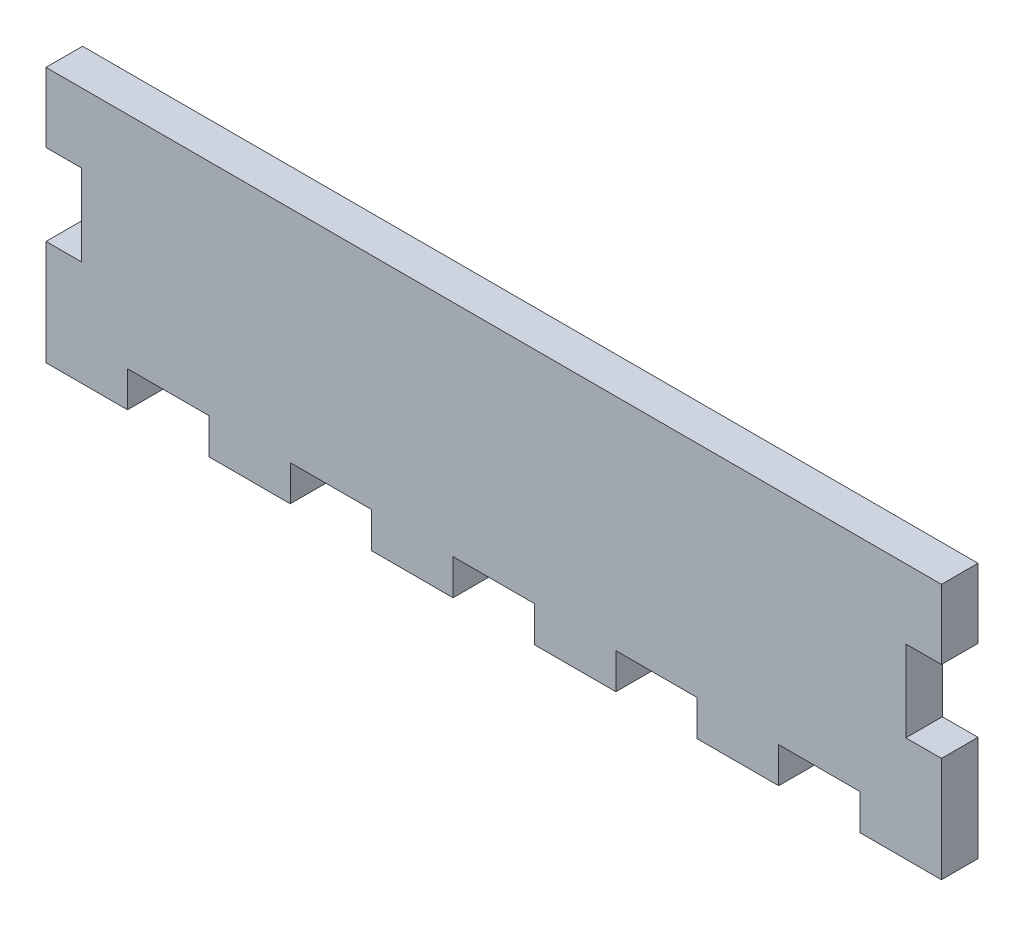
ISO-10303-21;
HEADER;
FILE_DESCRIPTION(('STEP AP214'),'2;1');
FILE_NAME('part.step','',(''),(''),'','','');
FILE_SCHEMA(('AUTOMOTIVE_DESIGN { 1 0 10303 214 1 1 1 1 }'));
ENDSEC;
DATA;
#1=APPLICATION_CONTEXT('core data for automotive mechanical design processes');
#2=APPLICATION_PROTOCOL_DEFINITION('international standard','automotive_design',2000,#1);
#3=PRODUCT_CONTEXT('',#1,'mechanical');
#4=PRODUCT('Part','Part','',(#3));
#5=PRODUCT_RELATED_PRODUCT_CATEGORY('part','',(#4));
#6=PRODUCT_DEFINITION_FORMATION('','',#4);
#7=PRODUCT_DEFINITION_CONTEXT('part definition',#1,'design');
#8=PRODUCT_DEFINITION('design','',#6,#7);
#9=PRODUCT_DEFINITION_SHAPE('','',#8);
#10=(LENGTH_UNIT() NAMED_UNIT(*) SI_UNIT(.MILLI.,.METRE.));
#11=(NAMED_UNIT(*) PLANE_ANGLE_UNIT() SI_UNIT($,.RADIAN.));
#12=(NAMED_UNIT(*) SI_UNIT($,.STERADIAN.) SOLID_ANGLE_UNIT());
#13=UNCERTAINTY_MEASURE_WITH_UNIT(LENGTH_MEASURE(1.E-05),#10,'distance_accuracy_value','');
#14=(GEOMETRIC_REPRESENTATION_CONTEXT(3) GLOBAL_UNCERTAINTY_ASSIGNED_CONTEXT((#13)) GLOBAL_UNIT_ASSIGNED_CONTEXT((#10,
#11,#12)) REPRESENTATION_CONTEXT('',''));
#15=CARTESIAN_POINT('',(0.,0.,0.));
#16=DIRECTION('',(0.,0.,1.));
#17=DIRECTION('',(1.,0.,0.));
#18=AXIS2_PLACEMENT_3D('',#15,#16,#17);
#19=CARTESIAN_POINT('',(-140.425884488404,0.0664562332948994,-4.));
#20=DIRECTION('',(-1.,0.,0.));
#21=DIRECTION('',(0.,0.,1.));
#22=AXIS2_PLACEMENT_3D('',#19,#20,#21);
#23=PLANE('',#22);
#24=DIRECTION('',(0.,-1.,0.));
#25=VECTOR('',#24,1.);
#26=CARTESIAN_POINT('',(-140.425884488404,0.0664562332948994,0.));
#27=LINE('',#26,#25);
#28=CARTESIAN_POINT('',(-140.425884488404,11.5664562332949,0.));
#29=VERTEX_POINT('',#28);
#30=CARTESIAN_POINT('',(-140.425884488404,0.0664562332948994,0.));
#31=VERTEX_POINT('',#30);
#32=EDGE_CURVE('E273',#29,#31,#27,.T.);
#33=ORIENTED_EDGE('',*,*,#32,.F.);
#34=DIRECTION('',(0.,0.,1.));
#35=VECTOR('',#34,1.);
#36=CARTESIAN_POINT('',(-140.425884488404,11.5664562332949,-4.));
#37=LINE('',#36,#35);
#38=CARTESIAN_POINT('',(-140.425884488404,11.5664562332949,-4.));
#39=VERTEX_POINT('',#38);
#40=EDGE_CURVE('E11',#39,#29,#37,.T.);
#41=ORIENTED_EDGE('',*,*,#40,.F.);
#42=DIRECTION('',(0.,-1.,0.));
#43=VECTOR('',#42,1.);
#44=CARTESIAN_POINT('',(-140.425884488404,0.0664562332948994,-4.));
#45=LINE('',#44,#43);
#46=CARTESIAN_POINT('',(-140.425884488404,0.0664562332948994,-4.));
#47=VERTEX_POINT('',#46);
#48=EDGE_CURVE('E365',#39,#47,#45,.T.);
#49=ORIENTED_EDGE('',*,*,#48,.T.);
#50=DIRECTION('',(0.,0.,1.));
#51=VECTOR('',#50,1.);
#52=CARTESIAN_POINT('',(-140.425884488404,0.0664562332948994,-4.));
#53=LINE('',#52,#51);
#54=EDGE_CURVE('E35',#47,#31,#53,.T.);
#55=ORIENTED_EDGE('',*,*,#54,.T.);
#56=EDGE_LOOP('',(#33,#41,#49,#55));
#57=FACE_BOUND('',#56,.T.);
#58=ADVANCED_FACE('F32',(#57),#23,.T.);
#59=CARTESIAN_POINT('',(-140.425884488404,11.5664562332949,-4.));
#60=DIRECTION('',(0.,1.,0.));
#61=DIRECTION('',(0.,0.,1.));
#62=AXIS2_PLACEMENT_3D('',#59,#60,#61);
#63=PLANE('',#62);
#64=DIRECTION('',(-1.,0.,0.));
#65=VECTOR('',#64,1.);
#66=CARTESIAN_POINT('',(-140.425884488404,11.5664562332949,0.));
#67=LINE('',#66,#65);
#68=CARTESIAN_POINT('',(-136.525884488404,11.5664562332949,0.));
#69=VERTEX_POINT('',#68);
#70=EDGE_CURVE('E363',#69,#29,#67,.T.);
#71=ORIENTED_EDGE('',*,*,#70,.F.);
#72=DIRECTION('',(0.,0.,1.));
#73=VECTOR('',#72,1.);
#74=CARTESIAN_POINT('',(-136.525884488404,11.5664562332949,-4.));
#75=LINE('',#74,#73);
#76=CARTESIAN_POINT('',(-136.525884488404,11.5664562332949,-4.));
#77=VERTEX_POINT('',#76);
#78=EDGE_CURVE('E41',#77,#69,#75,.T.);
#79=ORIENTED_EDGE('',*,*,#78,.F.);
#80=DIRECTION('',(-1.,0.,0.));
#81=VECTOR('',#80,1.);
#82=CARTESIAN_POINT('',(-140.425884488404,11.5664562332949,-4.));
#83=LINE('',#82,#81);
#84=EDGE_CURVE('E263',#77,#39,#83,.T.);
#85=ORIENTED_EDGE('',*,*,#84,.T.);
#86=ORIENTED_EDGE('',*,*,#40,.T.);
#87=EDGE_LOOP('',(#71,#79,#85,#86));
#88=FACE_BOUND('',#87,.T.);
#89=ADVANCED_FACE('F425',(#88),#63,.T.);
#90=CARTESIAN_POINT('',(-136.525884488404,20.4664562332949,-4.));
#91=DIRECTION('',(-1.,0.,0.));
#92=DIRECTION('',(0.,0.,1.));
#93=AXIS2_PLACEMENT_3D('',#90,#91,#92);
#94=PLANE('',#93);
#95=DIRECTION('',(0.,-1.,0.));
#96=VECTOR('',#95,1.);
#97=CARTESIAN_POINT('',(-136.525884488404,20.4664562332949,0.));
#98=LINE('',#97,#96);
#99=CARTESIAN_POINT('',(-136.525884488404,20.4664562332949,0.));
#100=VERTEX_POINT('',#99);
#101=EDGE_CURVE('E250',#100,#69,#98,.T.);
#102=ORIENTED_EDGE('',*,*,#101,.F.);
#103=DIRECTION('',(0.,0.,1.));
#104=VECTOR('',#103,1.);
#105=CARTESIAN_POINT('',(-136.525884488404,20.4664562332949,-4.));
#106=LINE('',#105,#104);
#107=CARTESIAN_POINT('',(-136.525884488404,20.4664562332949,-4.));
#108=VERTEX_POINT('',#107);
#109=EDGE_CURVE('E245',#108,#100,#106,.T.);
#110=ORIENTED_EDGE('',*,*,#109,.F.);
#111=DIRECTION('',(0.,-1.,0.));
#112=VECTOR('',#111,1.);
#113=CARTESIAN_POINT('',(-136.525884488404,20.4664562332949,-4.));
#114=LINE('',#113,#112);
#115=EDGE_CURVE('E248',#108,#77,#114,.T.);
#116=ORIENTED_EDGE('',*,*,#115,.T.);
#117=ORIENTED_EDGE('',*,*,#78,.T.);
#118=EDGE_LOOP('',(#102,#110,#116,#117));
#119=FACE_BOUND('',#118,.T.);
#120=ADVANCED_FACE('F247',(#119),#94,.T.);
#121=CARTESIAN_POINT('',(-140.425884488404,20.4664562332949,-4.));
#122=DIRECTION('',(0.,-1.,0.));
#123=DIRECTION('',(0.,0.,-1.));
#124=AXIS2_PLACEMENT_3D('',#121,#122,#123);
#125=PLANE('',#124);
#126=DIRECTION('',(1.,0.,0.));
#127=VECTOR('',#126,1.);
#128=CARTESIAN_POINT('',(-140.425884488404,20.4664562332949,0.));
#129=LINE('',#128,#127);
#130=CARTESIAN_POINT('',(-140.425884488404,20.4664562332949,0.));
#131=VERTEX_POINT('',#130);
#132=EDGE_CURVE('E360',#131,#100,#129,.T.);
#133=ORIENTED_EDGE('',*,*,#132,.F.);
#134=DIRECTION('',(0.,0.,1.));
#135=VECTOR('',#134,1.);
#136=CARTESIAN_POINT('',(-140.425884488404,20.4664562332949,-4.));
#137=LINE('',#136,#135);
#138=CARTESIAN_POINT('',(-140.425884488404,20.4664562332949,-4.));
#139=VERTEX_POINT('',#138);
#140=EDGE_CURVE('E255',#139,#131,#137,.T.);
#141=ORIENTED_EDGE('',*,*,#140,.F.);
#142=DIRECTION('',(1.,0.,0.));
#143=VECTOR('',#142,1.);
#144=CARTESIAN_POINT('',(-140.425884488404,20.4664562332949,-4.));
#145=LINE('',#144,#143);
#146=EDGE_CURVE('E261',#139,#108,#145,.T.);
#147=ORIENTED_EDGE('',*,*,#146,.T.);
#148=ORIENTED_EDGE('',*,*,#109,.T.);
#149=EDGE_LOOP('',(#133,#141,#147,#148));
#150=FACE_BOUND('',#149,.T.);
#151=ADVANCED_FACE('F265',(#150),#125,.T.);
#152=CARTESIAN_POINT('',(-140.425884488404,20.4664562332949,-4.));
#153=DIRECTION('',(-1.,0.,0.));
#154=DIRECTION('',(0.,0.,1.));
#155=AXIS2_PLACEMENT_3D('',#152,#153,#154);
#156=PLANE('',#155);
#157=DIRECTION('',(0.,-1.,0.));
#158=VECTOR('',#157,1.);
#159=CARTESIAN_POINT('',(-140.425884488404,20.4664562332949,0.));
#160=LINE('',#159,#158);
#161=CARTESIAN_POINT('',(-140.425884488404,28.0664562332949,0.));
#162=VERTEX_POINT('',#161);
#163=EDGE_CURVE('E357',#162,#131,#160,.T.);
#164=ORIENTED_EDGE('',*,*,#163,.F.);
#165=DIRECTION('',(0.,0.,1.));
#166=VECTOR('',#165,1.);
#167=CARTESIAN_POINT('',(-140.425884488404,28.0664562332949,-4.));
#168=LINE('',#167,#166);
#169=CARTESIAN_POINT('',(-140.425884488404,28.0664562332949,-4.));
#170=VERTEX_POINT('',#169);
#171=EDGE_CURVE('E369',#170,#162,#168,.T.);
#172=ORIENTED_EDGE('',*,*,#171,.F.);
#173=DIRECTION('',(0.,-1.,0.));
#174=VECTOR('',#173,1.);
#175=CARTESIAN_POINT('',(-140.425884488404,20.4664562332949,-4.));
#176=LINE('',#175,#174);
#177=EDGE_CURVE('E266',#170,#139,#176,.T.);
#178=ORIENTED_EDGE('',*,*,#177,.T.);
#179=ORIENTED_EDGE('',*,*,#140,.T.);
#180=EDGE_LOOP('',(#164,#172,#178,#179));
#181=FACE_BOUND('',#180,.T.);
#182=ADVANCED_FACE('F439',(#181),#156,.T.);
#183=CARTESIAN_POINT('',(-140.425884488404,28.0664562332949,-4.));
#184=DIRECTION('',(0.,1.,0.));
#185=DIRECTION('',(0.,0.,1.));
#186=AXIS2_PLACEMENT_3D('',#183,#184,#185);
#187=PLANE('',#186);
#188=DIRECTION('',(-1.,0.,0.));
#189=VECTOR('',#188,1.);
#190=CARTESIAN_POINT('',(-140.425884488404,28.0664562332949,0.));
#191=LINE('',#190,#189);
#192=CARTESIAN_POINT('',(-42.4258844884038,28.0664562332949,0.));
#193=VERTEX_POINT('',#192);
#194=EDGE_CURVE('E354',#193,#162,#191,.T.);
#195=ORIENTED_EDGE('',*,*,#194,.F.);
#196=DIRECTION('',(0.,0.,1.));
#197=VECTOR('',#196,1.);
#198=CARTESIAN_POINT('',(-42.4258844884038,28.0664562332949,-4.));
#199=LINE('',#198,#197);
#200=CARTESIAN_POINT('',(-42.4258844884038,28.0664562332949,-4.));
#201=VERTEX_POINT('',#200);
#202=EDGE_CURVE('E371',#201,#193,#199,.T.);
#203=ORIENTED_EDGE('',*,*,#202,.F.);
#204=DIRECTION('',(-1.,0.,0.));
#205=VECTOR('',#204,1.);
#206=CARTESIAN_POINT('',(-140.425884488404,28.0664562332949,-4.));
#207=LINE('',#206,#205);
#208=EDGE_CURVE('E268',#201,#170,#207,.T.);
#209=ORIENTED_EDGE('',*,*,#208,.T.);
#210=ORIENTED_EDGE('',*,*,#171,.T.);
#211=EDGE_LOOP('',(#195,#203,#209,#210));
#212=FACE_BOUND('',#211,.T.);
#213=ADVANCED_FACE('F442',(#212),#187,.T.);
#214=CARTESIAN_POINT('',(-42.4258844884038,20.4664562332949,-4.));
#215=DIRECTION('',(1.,0.,0.));
#216=DIRECTION('',(0.,0.,-1.));
#217=AXIS2_PLACEMENT_3D('',#214,#215,#216);
#218=PLANE('',#217);
#219=DIRECTION('',(0.,1.,0.));
#220=VECTOR('',#219,1.);
#221=CARTESIAN_POINT('',(-42.4258844884038,20.4664562332949,0.));
#222=LINE('',#221,#220);
#223=CARTESIAN_POINT('',(-42.4258844884038,20.4664562332949,0.));
#224=VERTEX_POINT('',#223);
#225=EDGE_CURVE('E351',#224,#193,#222,.T.);
#226=ORIENTED_EDGE('',*,*,#225,.F.);
#227=DIRECTION('',(0.,0.,1.));
#228=VECTOR('',#227,1.);
#229=CARTESIAN_POINT('',(-42.4258844884038,20.4664562332949,-4.));
#230=LINE('',#229,#228);
#231=CARTESIAN_POINT('',(-42.4258844884038,20.4664562332949,-4.));
#232=VERTEX_POINT('',#231);
#233=EDGE_CURVE('E373',#232,#224,#230,.T.);
#234=ORIENTED_EDGE('',*,*,#233,.F.);
#235=DIRECTION('',(0.,1.,0.));
#236=VECTOR('',#235,1.);
#237=CARTESIAN_POINT('',(-42.4258844884038,20.4664562332949,-4.));
#238=LINE('',#237,#236);
#239=EDGE_CURVE('E848',#232,#201,#238,.T.);
#240=ORIENTED_EDGE('',*,*,#239,.T.);
#241=ORIENTED_EDGE('',*,*,#202,.T.);
#242=EDGE_LOOP('',(#226,#234,#240,#241));
#243=FACE_BOUND('',#242,.T.);
#244=ADVANCED_FACE('F446',(#243),#218,.T.);
#245=CARTESIAN_POINT('',(-42.4258844884038,20.4664562332949,-4.));
#246=DIRECTION('',(0.,-1.,0.));
#247=DIRECTION('',(0.,0.,-1.));
#248=AXIS2_PLACEMENT_3D('',#245,#246,#247);
#249=PLANE('',#248);
#250=DIRECTION('',(1.,0.,0.));
#251=VECTOR('',#250,1.);
#252=CARTESIAN_POINT('',(-42.4258844884038,20.4664562332949,0.));
#253=LINE('',#252,#251);
#254=CARTESIAN_POINT('',(-46.3258844884038,20.4664562332949,0.));
#255=VERTEX_POINT('',#254);
#256=EDGE_CURVE('E348',#255,#224,#253,.T.);
#257=ORIENTED_EDGE('',*,*,#256,.F.);
#258=DIRECTION('',(0.,0.,1.));
#259=VECTOR('',#258,1.);
#260=CARTESIAN_POINT('',(-46.3258844884038,20.4664562332949,-4.));
#261=LINE('',#260,#259);
#262=CARTESIAN_POINT('',(-46.3258844884038,20.4664562332949,-4.));
#263=VERTEX_POINT('',#262);
#264=EDGE_CURVE('E375',#263,#255,#261,.T.);
#265=ORIENTED_EDGE('',*,*,#264,.F.);
#266=DIRECTION('',(1.,0.,0.));
#267=VECTOR('',#266,1.);
#268=CARTESIAN_POINT('',(-42.4258844884038,20.4664562332949,-4.));
#269=LINE('',#268,#267);
#270=EDGE_CURVE('E841',#263,#232,#269,.T.);
#271=ORIENTED_EDGE('',*,*,#270,.T.);
#272=ORIENTED_EDGE('',*,*,#233,.T.);
#273=EDGE_LOOP('',(#257,#265,#271,#272));
#274=FACE_BOUND('',#273,.T.);
#275=ADVANCED_FACE('F450',(#274),#249,.T.);
#276=CARTESIAN_POINT('',(-46.3258844884038,20.4664562332949,-4.));
#277=DIRECTION('',(1.,0.,0.));
#278=DIRECTION('',(0.,0.,-1.));
#279=AXIS2_PLACEMENT_3D('',#276,#277,#278);
#280=PLANE('',#279);
#281=DIRECTION('',(0.,1.,0.));
#282=VECTOR('',#281,1.);
#283=CARTESIAN_POINT('',(-46.3258844884038,20.4664562332949,0.));
#284=LINE('',#283,#282);
#285=CARTESIAN_POINT('',(-46.3258844884038,11.5664562332949,0.));
#286=VERTEX_POINT('',#285);
#287=EDGE_CURVE('E345',#286,#255,#284,.T.);
#288=ORIENTED_EDGE('',*,*,#287,.F.);
#289=DIRECTION('',(0.,0.,1.));
#290=VECTOR('',#289,1.);
#291=CARTESIAN_POINT('',(-46.3258844884038,11.5664562332949,-4.));
#292=LINE('',#291,#290);
#293=CARTESIAN_POINT('',(-46.3258844884038,11.5664562332949,-4.));
#294=VERTEX_POINT('',#293);
#295=EDGE_CURVE('E377',#294,#286,#292,.T.);
#296=ORIENTED_EDGE('',*,*,#295,.F.);
#297=DIRECTION('',(0.,1.,0.));
#298=VECTOR('',#297,1.);
#299=CARTESIAN_POINT('',(-46.3258844884038,20.4664562332949,-4.));
#300=LINE('',#299,#298);
#301=EDGE_CURVE('E837',#294,#263,#300,.T.);
#302=ORIENTED_EDGE('',*,*,#301,.T.);
#303=ORIENTED_EDGE('',*,*,#264,.T.);
#304=EDGE_LOOP('',(#288,#296,#302,#303));
#305=FACE_BOUND('',#304,.T.);
#306=ADVANCED_FACE('F454',(#305),#280,.T.);
#307=CARTESIAN_POINT('',(-42.4258844884038,11.5664562332949,-4.));
#308=DIRECTION('',(0.,1.,0.));
#309=DIRECTION('',(0.,0.,1.));
#310=AXIS2_PLACEMENT_3D('',#307,#308,#309);
#311=PLANE('',#310);
#312=DIRECTION('',(-1.,0.,0.));
#313=VECTOR('',#312,1.);
#314=CARTESIAN_POINT('',(-42.4258844884038,11.5664562332949,0.));
#315=LINE('',#314,#313);
#316=CARTESIAN_POINT('',(-42.4258844884038,11.5664562332949,0.));
#317=VERTEX_POINT('',#316);
#318=EDGE_CURVE('E342',#317,#286,#315,.T.);
#319=ORIENTED_EDGE('',*,*,#318,.F.);
#320=DIRECTION('',(0.,0.,1.));
#321=VECTOR('',#320,1.);
#322=CARTESIAN_POINT('',(-42.4258844884038,11.5664562332949,-4.));
#323=LINE('',#322,#321);
#324=CARTESIAN_POINT('',(-42.4258844884038,11.5664562332949,-4.));
#325=VERTEX_POINT('',#324);
#326=EDGE_CURVE('E379',#325,#317,#323,.T.);
#327=ORIENTED_EDGE('',*,*,#326,.F.);
#328=DIRECTION('',(-1.,0.,0.));
#329=VECTOR('',#328,1.);
#330=CARTESIAN_POINT('',(-42.4258844884038,11.5664562332949,-4.));
#331=LINE('',#330,#329);
#332=EDGE_CURVE('E853',#325,#294,#331,.T.);
#333=ORIENTED_EDGE('',*,*,#332,.T.);
#334=ORIENTED_EDGE('',*,*,#295,.T.);
#335=EDGE_LOOP('',(#319,#327,#333,#334));
#336=FACE_BOUND('',#335,.T.);
#337=ADVANCED_FACE('F458',(#336),#311,.T.);
#338=CARTESIAN_POINT('',(-42.4258844884038,0.0664562332948994,-4.));
#339=DIRECTION('',(1.,0.,0.));
#340=DIRECTION('',(0.,0.,-1.));
#341=AXIS2_PLACEMENT_3D('',#338,#339,#340);
#342=PLANE('',#341);
#343=DIRECTION('',(0.,1.,0.));
#344=VECTOR('',#343,1.);
#345=CARTESIAN_POINT('',(-42.4258844884038,0.0664562332948994,0.));
#346=LINE('',#345,#344);
#347=CARTESIAN_POINT('',(-42.4258844884038,0.0664562332948994,0.));
#348=VERTEX_POINT('',#347);
#349=EDGE_CURVE('E339',#348,#317,#346,.T.);
#350=ORIENTED_EDGE('',*,*,#349,.F.);
#351=DIRECTION('',(0.,0.,1.));
#352=VECTOR('',#351,1.);
#353=CARTESIAN_POINT('',(-42.4258844884038,0.0664562332948994,-4.));
#354=LINE('',#353,#352);
#355=CARTESIAN_POINT('',(-42.4258844884038,0.0664562332948994,-4.));
#356=VERTEX_POINT('',#355);
#357=EDGE_CURVE('E381',#356,#348,#354,.T.);
#358=ORIENTED_EDGE('',*,*,#357,.F.);
#359=DIRECTION('',(0.,1.,0.));
#360=VECTOR('',#359,1.);
#361=CARTESIAN_POINT('',(-42.4258844884038,0.0664562332948994,-4.));
#362=LINE('',#361,#360);
#363=EDGE_CURVE('E830',#356,#325,#362,.T.);
#364=ORIENTED_EDGE('',*,*,#363,.T.);
#365=ORIENTED_EDGE('',*,*,#326,.T.);
#366=EDGE_LOOP('',(#350,#358,#364,#365));
#367=FACE_BOUND('',#366,.T.);
#368=ADVANCED_FACE('F462',(#367),#342,.T.);
#369=CARTESIAN_POINT('',(-51.3425511550705,0.0664562332948994,-4.));
#370=DIRECTION('',(0.,-1.,0.));
#371=DIRECTION('',(0.,0.,-1.));
#372=AXIS2_PLACEMENT_3D('',#369,#370,#371);
#373=PLANE('',#372);
#374=DIRECTION('',(1.,0.,0.));
#375=VECTOR('',#374,1.);
#376=CARTESIAN_POINT('',(-51.3425511550705,0.0664562332948994,0.));
#377=LINE('',#376,#375);
#378=CARTESIAN_POINT('',(-51.3425511550705,0.0664562332948994,0.));
#379=VERTEX_POINT('',#378);
#380=EDGE_CURVE('E336',#379,#348,#377,.T.);
#381=ORIENTED_EDGE('',*,*,#380,.F.);
#382=DIRECTION('',(0.,0.,1.));
#383=VECTOR('',#382,1.);
#384=CARTESIAN_POINT('',(-51.3425511550705,0.0664562332948994,-4.));
#385=LINE('',#384,#383);
#386=CARTESIAN_POINT('',(-51.3425511550705,0.0664562332948994,-4.));
#387=VERTEX_POINT('',#386);
#388=EDGE_CURVE('E383',#387,#379,#385,.T.);
#389=ORIENTED_EDGE('',*,*,#388,.F.);
#390=DIRECTION('',(1.,0.,0.));
#391=VECTOR('',#390,1.);
#392=CARTESIAN_POINT('',(-51.3425511550705,0.0664562332948994,-4.));
#393=LINE('',#392,#391);
#394=EDGE_CURVE('E826',#387,#356,#393,.T.);
#395=ORIENTED_EDGE('',*,*,#394,.T.);
#396=ORIENTED_EDGE('',*,*,#357,.T.);
#397=EDGE_LOOP('',(#381,#389,#395,#396));
#398=FACE_BOUND('',#397,.T.);
#399=ADVANCED_FACE('F466',(#398),#373,.T.);
#400=CARTESIAN_POINT('',(-51.3425511550705,0.0664562332948994,-4.));
#401=DIRECTION('',(-1.,0.,0.));
#402=DIRECTION('',(0.,0.,1.));
#403=AXIS2_PLACEMENT_3D('',#400,#401,#402);
#404=PLANE('',#403);
#405=DIRECTION('',(0.,-1.,0.));
#406=VECTOR('',#405,1.);
#407=CARTESIAN_POINT('',(-51.3425511550705,0.0664562332948994,0.));
#408=LINE('',#407,#406);
#409=CARTESIAN_POINT('',(-51.3425511550705,3.9664562332949,0.));
#410=VERTEX_POINT('',#409);
#411=EDGE_CURVE('E333',#410,#379,#408,.T.);
#412=ORIENTED_EDGE('',*,*,#411,.F.);
#413=DIRECTION('',(0.,0.,1.));
#414=VECTOR('',#413,1.);
#415=CARTESIAN_POINT('',(-51.3425511550705,3.9664562332949,-4.));
#416=LINE('',#415,#414);
#417=CARTESIAN_POINT('',(-51.3425511550705,3.9664562332949,-4.));
#418=VERTEX_POINT('',#417);
#419=EDGE_CURVE('E385',#418,#410,#416,.T.);
#420=ORIENTED_EDGE('',*,*,#419,.F.);
#421=DIRECTION('',(0.,-1.,0.));
#422=VECTOR('',#421,1.);
#423=CARTESIAN_POINT('',(-51.3425511550705,0.0664562332948994,-4.));
#424=LINE('',#423,#422);
#425=EDGE_CURVE('E857',#418,#387,#424,.T.);
#426=ORIENTED_EDGE('',*,*,#425,.T.);
#427=ORIENTED_EDGE('',*,*,#388,.T.);
#428=EDGE_LOOP('',(#412,#420,#426,#427));
#429=FACE_BOUND('',#428,.T.);
#430=ADVANCED_FACE('F470',(#429),#404,.T.);
#431=CARTESIAN_POINT('',(-60.2425511550705,3.9664562332949,-4.));
#432=DIRECTION('',(0.,-1.,0.));
#433=DIRECTION('',(0.,0.,-1.));
#434=AXIS2_PLACEMENT_3D('',#431,#432,#433);
#435=PLANE('',#434);
#436=DIRECTION('',(1.,0.,0.));
#437=VECTOR('',#436,1.);
#438=CARTESIAN_POINT('',(-60.2425511550705,3.9664562332949,0.));
#439=LINE('',#438,#437);
#440=CARTESIAN_POINT('',(-60.2425511550705,3.9664562332949,0.));
#441=VERTEX_POINT('',#440);
#442=EDGE_CURVE('E330',#441,#410,#439,.T.);
#443=ORIENTED_EDGE('',*,*,#442,.F.);
#444=DIRECTION('',(0.,0.,1.));
#445=VECTOR('',#444,1.);
#446=CARTESIAN_POINT('',(-60.2425511550705,3.9664562332949,-4.));
#447=LINE('',#446,#445);
#448=CARTESIAN_POINT('',(-60.2425511550705,3.9664562332949,-4.));
#449=VERTEX_POINT('',#448);
#450=EDGE_CURVE('E387',#449,#441,#447,.T.);
#451=ORIENTED_EDGE('',*,*,#450,.F.);
#452=DIRECTION('',(1.,0.,0.));
#453=VECTOR('',#452,1.);
#454=CARTESIAN_POINT('',(-60.2425511550705,3.9664562332949,-4.));
#455=LINE('',#454,#453);
#456=EDGE_CURVE('E819',#449,#418,#455,.T.);
#457=ORIENTED_EDGE('',*,*,#456,.T.);
#458=ORIENTED_EDGE('',*,*,#419,.T.);
#459=EDGE_LOOP('',(#443,#451,#457,#458));
#460=FACE_BOUND('',#459,.T.);
#461=ADVANCED_FACE('F474',(#460),#435,.T.);
#462=CARTESIAN_POINT('',(-60.2425511550705,0.0664562332948994,-4.));
#463=DIRECTION('',(1.,0.,0.));
#464=DIRECTION('',(0.,0.,-1.));
#465=AXIS2_PLACEMENT_3D('',#462,#463,#464);
#466=PLANE('',#465);
#467=DIRECTION('',(0.,1.,0.));
#468=VECTOR('',#467,1.);
#469=CARTESIAN_POINT('',(-60.2425511550705,0.0664562332948994,0.));
#470=LINE('',#469,#468);
#471=CARTESIAN_POINT('',(-60.2425511550705,0.0664562332948994,0.));
#472=VERTEX_POINT('',#471);
#473=EDGE_CURVE('E327',#472,#441,#470,.T.);
#474=ORIENTED_EDGE('',*,*,#473,.F.);
#475=DIRECTION('',(0.,0.,1.));
#476=VECTOR('',#475,1.);
#477=CARTESIAN_POINT('',(-60.2425511550705,0.0664562332948994,-4.));
#478=LINE('',#477,#476);
#479=CARTESIAN_POINT('',(-60.2425511550705,0.0664562332948994,-4.));
#480=VERTEX_POINT('',#479);
#481=EDGE_CURVE('E389',#480,#472,#478,.T.);
#482=ORIENTED_EDGE('',*,*,#481,.F.);
#483=DIRECTION('',(0.,1.,0.));
#484=VECTOR('',#483,1.);
#485=CARTESIAN_POINT('',(-60.2425511550705,0.0664562332948994,-4.));
#486=LINE('',#485,#484);
#487=EDGE_CURVE('E815',#480,#449,#486,.T.);
#488=ORIENTED_EDGE('',*,*,#487,.T.);
#489=ORIENTED_EDGE('',*,*,#450,.T.);
#490=EDGE_LOOP('',(#474,#482,#488,#489));
#491=FACE_BOUND('',#490,.T.);
#492=ADVANCED_FACE('F478',(#491),#466,.T.);
#493=CARTESIAN_POINT('',(-69.1592178217372,0.0664562332948994,-4.));
#494=DIRECTION('',(0.,-1.,0.));
#495=DIRECTION('',(0.,0.,-1.));
#496=AXIS2_PLACEMENT_3D('',#493,#494,#495);
#497=PLANE('',#496);
#498=DIRECTION('',(1.,0.,0.));
#499=VECTOR('',#498,1.);
#500=CARTESIAN_POINT('',(-69.1592178217372,0.0664562332948994,0.));
#501=LINE('',#500,#499);
#502=CARTESIAN_POINT('',(-69.1592178217372,0.0664562332948994,0.));
#503=VERTEX_POINT('',#502);
#504=EDGE_CURVE('E324',#503,#472,#501,.T.);
#505=ORIENTED_EDGE('',*,*,#504,.F.);
#506=DIRECTION('',(0.,0.,1.));
#507=VECTOR('',#506,1.);
#508=CARTESIAN_POINT('',(-69.1592178217372,0.0664562332948994,-4.));
#509=LINE('',#508,#507);
#510=CARTESIAN_POINT('',(-69.1592178217372,0.0664562332948994,-4.));
#511=VERTEX_POINT('',#510);
#512=EDGE_CURVE('E391',#511,#503,#509,.T.);
#513=ORIENTED_EDGE('',*,*,#512,.F.);
#514=DIRECTION('',(1.,0.,0.));
#515=VECTOR('',#514,1.);
#516=CARTESIAN_POINT('',(-69.1592178217372,0.0664562332948994,-4.));
#517=LINE('',#516,#515);
#518=EDGE_CURVE('E861',#511,#480,#517,.T.);
#519=ORIENTED_EDGE('',*,*,#518,.T.);
#520=ORIENTED_EDGE('',*,*,#481,.T.);
#521=EDGE_LOOP('',(#505,#513,#519,#520));
#522=FACE_BOUND('',#521,.T.);
#523=ADVANCED_FACE('F482',(#522),#497,.T.);
#524=CARTESIAN_POINT('',(-69.1592178217372,0.0664562332948994,-4.));
#525=DIRECTION('',(-1.,0.,0.));
#526=DIRECTION('',(0.,0.,1.));
#527=AXIS2_PLACEMENT_3D('',#524,#525,#526);
#528=PLANE('',#527);
#529=DIRECTION('',(0.,-1.,0.));
#530=VECTOR('',#529,1.);
#531=CARTESIAN_POINT('',(-69.1592178217372,0.0664562332948994,0.));
#532=LINE('',#531,#530);
#533=CARTESIAN_POINT('',(-69.1592178217372,3.9664562332949,0.));
#534=VERTEX_POINT('',#533);
#535=EDGE_CURVE('E321',#534,#503,#532,.T.);
#536=ORIENTED_EDGE('',*,*,#535,.F.);
#537=DIRECTION('',(0.,0.,1.));
#538=VECTOR('',#537,1.);
#539=CARTESIAN_POINT('',(-69.1592178217372,3.9664562332949,-4.));
#540=LINE('',#539,#538);
#541=CARTESIAN_POINT('',(-69.1592178217372,3.9664562332949,-4.));
#542=VERTEX_POINT('',#541);
#543=EDGE_CURVE('E393',#542,#534,#540,.T.);
#544=ORIENTED_EDGE('',*,*,#543,.F.);
#545=DIRECTION('',(0.,-1.,0.));
#546=VECTOR('',#545,1.);
#547=CARTESIAN_POINT('',(-69.1592178217372,0.0664562332948994,-4.));
#548=LINE('',#547,#546);
#549=EDGE_CURVE('E808',#542,#511,#548,.T.);
#550=ORIENTED_EDGE('',*,*,#549,.T.);
#551=ORIENTED_EDGE('',*,*,#512,.T.);
#552=EDGE_LOOP('',(#536,#544,#550,#551));
#553=FACE_BOUND('',#552,.T.);
#554=ADVANCED_FACE('F486',(#553),#528,.T.);
#555=CARTESIAN_POINT('',(-78.0592178217372,3.9664562332949,-4.));
#556=DIRECTION('',(0.,-1.,0.));
#557=DIRECTION('',(0.,0.,-1.));
#558=AXIS2_PLACEMENT_3D('',#555,#556,#557);
#559=PLANE('',#558);
#560=DIRECTION('',(1.,0.,0.));
#561=VECTOR('',#560,1.);
#562=CARTESIAN_POINT('',(-78.0592178217372,3.9664562332949,0.));
#563=LINE('',#562,#561);
#564=CARTESIAN_POINT('',(-78.0592178217372,3.9664562332949,0.));
#565=VERTEX_POINT('',#564);
#566=EDGE_CURVE('E318',#565,#534,#563,.T.);
#567=ORIENTED_EDGE('',*,*,#566,.F.);
#568=DIRECTION('',(0.,0.,1.));
#569=VECTOR('',#568,1.);
#570=CARTESIAN_POINT('',(-78.0592178217372,3.9664562332949,-4.));
#571=LINE('',#570,#569);
#572=CARTESIAN_POINT('',(-78.0592178217372,3.9664562332949,-4.));
#573=VERTEX_POINT('',#572);
#574=EDGE_CURVE('E395',#573,#565,#571,.T.);
#575=ORIENTED_EDGE('',*,*,#574,.F.);
#576=DIRECTION('',(1.,0.,0.));
#577=VECTOR('',#576,1.);
#578=CARTESIAN_POINT('',(-78.0592178217372,3.9664562332949,-4.));
#579=LINE('',#578,#577);
#580=EDGE_CURVE('E804',#573,#542,#579,.T.);
#581=ORIENTED_EDGE('',*,*,#580,.T.);
#582=ORIENTED_EDGE('',*,*,#543,.T.);
#583=EDGE_LOOP('',(#567,#575,#581,#582));
#584=FACE_BOUND('',#583,.T.);
#585=ADVANCED_FACE('F490',(#584),#559,.T.);
#586=CARTESIAN_POINT('',(-78.0592178217372,0.0664562332948994,-4.));
#587=DIRECTION('',(1.,0.,0.));
#588=DIRECTION('',(0.,0.,-1.));
#589=AXIS2_PLACEMENT_3D('',#586,#587,#588);
#590=PLANE('',#589);
#591=DIRECTION('',(0.,1.,0.));
#592=VECTOR('',#591,1.);
#593=CARTESIAN_POINT('',(-78.0592178217372,0.0664562332948994,0.));
#594=LINE('',#593,#592);
#595=CARTESIAN_POINT('',(-78.0592178217372,0.0664562332948994,0.));
#596=VERTEX_POINT('',#595);
#597=EDGE_CURVE('E315',#596,#565,#594,.T.);
#598=ORIENTED_EDGE('',*,*,#597,.F.);
#599=DIRECTION('',(0.,0.,1.));
#600=VECTOR('',#599,1.);
#601=CARTESIAN_POINT('',(-78.0592178217372,0.0664562332948994,-4.));
#602=LINE('',#601,#600);
#603=CARTESIAN_POINT('',(-78.0592178217372,0.0664562332948994,-4.));
#604=VERTEX_POINT('',#603);
#605=EDGE_CURVE('E397',#604,#596,#602,.T.);
#606=ORIENTED_EDGE('',*,*,#605,.F.);
#607=DIRECTION('',(0.,1.,0.));
#608=VECTOR('',#607,1.);
#609=CARTESIAN_POINT('',(-78.0592178217372,0.0664562332948994,-4.));
#610=LINE('',#609,#608);
#611=EDGE_CURVE('E865',#604,#573,#610,.T.);
#612=ORIENTED_EDGE('',*,*,#611,.T.);
#613=ORIENTED_EDGE('',*,*,#574,.T.);
#614=EDGE_LOOP('',(#598,#606,#612,#613));
#615=FACE_BOUND('',#614,.T.);
#616=ADVANCED_FACE('F494',(#615),#590,.T.);
#617=CARTESIAN_POINT('',(-86.9758844884038,0.0664562332948994,-4.));
#618=DIRECTION('',(0.,-1.,0.));
#619=DIRECTION('',(0.,0.,-1.));
#620=AXIS2_PLACEMENT_3D('',#617,#618,#619);
#621=PLANE('',#620);
#622=DIRECTION('',(1.,0.,0.));
#623=VECTOR('',#622,1.);
#624=CARTESIAN_POINT('',(-86.9758844884038,0.0664562332948994,0.));
#625=LINE('',#624,#623);
#626=CARTESIAN_POINT('',(-86.9758844884038,0.0664562332948994,0.));
#627=VERTEX_POINT('',#626);
#628=EDGE_CURVE('E312',#627,#596,#625,.T.);
#629=ORIENTED_EDGE('',*,*,#628,.F.);
#630=DIRECTION('',(0.,0.,1.));
#631=VECTOR('',#630,1.);
#632=CARTESIAN_POINT('',(-86.9758844884038,0.0664562332948994,-4.));
#633=LINE('',#632,#631);
#634=CARTESIAN_POINT('',(-86.9758844884038,0.0664562332948994,-4.));
#635=VERTEX_POINT('',#634);
#636=EDGE_CURVE('E399',#635,#627,#633,.T.);
#637=ORIENTED_EDGE('',*,*,#636,.F.);
#638=DIRECTION('',(1.,0.,0.));
#639=VECTOR('',#638,1.);
#640=CARTESIAN_POINT('',(-86.9758844884038,0.0664562332948994,-4.));
#641=LINE('',#640,#639);
#642=EDGE_CURVE('E797',#635,#604,#641,.T.);
#643=ORIENTED_EDGE('',*,*,#642,.T.);
#644=ORIENTED_EDGE('',*,*,#605,.T.);
#645=EDGE_LOOP('',(#629,#637,#643,#644));
#646=FACE_BOUND('',#645,.T.);
#647=ADVANCED_FACE('F498',(#646),#621,.T.);
#648=CARTESIAN_POINT('',(-86.9758844884038,0.0664562332948994,-4.));
#649=DIRECTION('',(-1.,0.,0.));
#650=DIRECTION('',(0.,0.,1.));
#651=AXIS2_PLACEMENT_3D('',#648,#649,#650);
#652=PLANE('',#651);
#653=DIRECTION('',(0.,-1.,0.));
#654=VECTOR('',#653,1.);
#655=CARTESIAN_POINT('',(-86.9758844884038,0.0664562332948994,0.));
#656=LINE('',#655,#654);
#657=CARTESIAN_POINT('',(-86.9758844884038,3.9664562332949,0.));
#658=VERTEX_POINT('',#657);
#659=EDGE_CURVE('E309',#658,#627,#656,.T.);
#660=ORIENTED_EDGE('',*,*,#659,.F.);
#661=DIRECTION('',(0.,0.,1.));
#662=VECTOR('',#661,1.);
#663=CARTESIAN_POINT('',(-86.9758844884038,3.9664562332949,-4.));
#664=LINE('',#663,#662);
#665=CARTESIAN_POINT('',(-86.9758844884038,3.9664562332949,-4.));
#666=VERTEX_POINT('',#665);
#667=EDGE_CURVE('E401',#666,#658,#664,.T.);
#668=ORIENTED_EDGE('',*,*,#667,.F.);
#669=DIRECTION('',(0.,-1.,0.));
#670=VECTOR('',#669,1.);
#671=CARTESIAN_POINT('',(-86.9758844884038,0.0664562332948994,-4.));
#672=LINE('',#671,#670);
#673=EDGE_CURVE('E793',#666,#635,#672,.T.);
#674=ORIENTED_EDGE('',*,*,#673,.T.);
#675=ORIENTED_EDGE('',*,*,#636,.T.);
#676=EDGE_LOOP('',(#660,#668,#674,#675));
#677=FACE_BOUND('',#676,.T.);
#678=ADVANCED_FACE('F502',(#677),#652,.T.);
#679=CARTESIAN_POINT('',(-95.8758844884038,3.9664562332949,-4.));
#680=DIRECTION('',(0.,-1.,0.));
#681=DIRECTION('',(0.,0.,-1.));
#682=AXIS2_PLACEMENT_3D('',#679,#680,#681);
#683=PLANE('',#682);
#684=DIRECTION('',(1.,0.,0.));
#685=VECTOR('',#684,1.);
#686=CARTESIAN_POINT('',(-95.8758844884038,3.9664562332949,0.));
#687=LINE('',#686,#685);
#688=CARTESIAN_POINT('',(-95.8758844884038,3.9664562332949,0.));
#689=VERTEX_POINT('',#688);
#690=EDGE_CURVE('E306',#689,#658,#687,.T.);
#691=ORIENTED_EDGE('',*,*,#690,.F.);
#692=DIRECTION('',(0.,0.,1.));
#693=VECTOR('',#692,1.);
#694=CARTESIAN_POINT('',(-95.8758844884038,3.9664562332949,-4.));
#695=LINE('',#694,#693);
#696=CARTESIAN_POINT('',(-95.8758844884038,3.9664562332949,-4.));
#697=VERTEX_POINT('',#696);
#698=EDGE_CURVE('E403',#697,#689,#695,.T.);
#699=ORIENTED_EDGE('',*,*,#698,.F.);
#700=DIRECTION('',(1.,0.,0.));
#701=VECTOR('',#700,1.);
#702=CARTESIAN_POINT('',(-95.8758844884038,3.9664562332949,-4.));
#703=LINE('',#702,#701);
#704=EDGE_CURVE('E869',#697,#666,#703,.T.);
#705=ORIENTED_EDGE('',*,*,#704,.T.);
#706=ORIENTED_EDGE('',*,*,#667,.T.);
#707=EDGE_LOOP('',(#691,#699,#705,#706));
#708=FACE_BOUND('',#707,.T.);
#709=ADVANCED_FACE('F506',(#708),#683,.T.);
#710=CARTESIAN_POINT('',(-95.8758844884038,0.0664562332948994,-4.));
#711=DIRECTION('',(1.,0.,0.));
#712=DIRECTION('',(0.,0.,-1.));
#713=AXIS2_PLACEMENT_3D('',#710,#711,#712);
#714=PLANE('',#713);
#715=DIRECTION('',(0.,1.,0.));
#716=VECTOR('',#715,1.);
#717=CARTESIAN_POINT('',(-95.8758844884038,0.0664562332948994,0.));
#718=LINE('',#717,#716);
#719=CARTESIAN_POINT('',(-95.8758844884038,0.0664562332948994,0.));
#720=VERTEX_POINT('',#719);
#721=EDGE_CURVE('E303',#720,#689,#718,.T.);
#722=ORIENTED_EDGE('',*,*,#721,.F.);
#723=DIRECTION('',(0.,0.,1.));
#724=VECTOR('',#723,1.);
#725=CARTESIAN_POINT('',(-95.8758844884038,0.0664562332948994,-4.));
#726=LINE('',#725,#724);
#727=CARTESIAN_POINT('',(-95.8758844884038,0.0664562332948994,-4.));
#728=VERTEX_POINT('',#727);
#729=EDGE_CURVE('E405',#728,#720,#726,.T.);
#730=ORIENTED_EDGE('',*,*,#729,.F.);
#731=DIRECTION('',(0.,1.,0.));
#732=VECTOR('',#731,1.);
#733=CARTESIAN_POINT('',(-95.8758844884038,0.0664562332948994,-4.));
#734=LINE('',#733,#732);
#735=EDGE_CURVE('E786',#728,#697,#734,.T.);
#736=ORIENTED_EDGE('',*,*,#735,.T.);
#737=ORIENTED_EDGE('',*,*,#698,.T.);
#738=EDGE_LOOP('',(#722,#730,#736,#737));
#739=FACE_BOUND('',#738,.T.);
#740=ADVANCED_FACE('F510',(#739),#714,.T.);
#741=CARTESIAN_POINT('',(-104.792551155071,0.0664562332948994,-4.));
#742=DIRECTION('',(0.,-1.,0.));
#743=DIRECTION('',(0.,0.,-1.));
#744=AXIS2_PLACEMENT_3D('',#741,#742,#743);
#745=PLANE('',#744);
#746=DIRECTION('',(1.,0.,0.));
#747=VECTOR('',#746,1.);
#748=CARTESIAN_POINT('',(-104.792551155071,0.0664562332948994,0.));
#749=LINE('',#748,#747);
#750=CARTESIAN_POINT('',(-104.792551155071,0.0664562332948994,0.));
#751=VERTEX_POINT('',#750);
#752=EDGE_CURVE('E300',#751,#720,#749,.T.);
#753=ORIENTED_EDGE('',*,*,#752,.F.);
#754=DIRECTION('',(0.,0.,1.));
#755=VECTOR('',#754,1.);
#756=CARTESIAN_POINT('',(-104.792551155071,0.0664562332948994,-4.));
#757=LINE('',#756,#755);
#758=CARTESIAN_POINT('',(-104.792551155071,0.0664562332948994,-4.));
#759=VERTEX_POINT('',#758);
#760=EDGE_CURVE('E407',#759,#751,#757,.T.);
#761=ORIENTED_EDGE('',*,*,#760,.F.);
#762=DIRECTION('',(1.,0.,0.));
#763=VECTOR('',#762,1.);
#764=CARTESIAN_POINT('',(-104.792551155071,0.0664562332948994,-4.));
#765=LINE('',#764,#763);
#766=EDGE_CURVE('E782',#759,#728,#765,.T.);
#767=ORIENTED_EDGE('',*,*,#766,.T.);
#768=ORIENTED_EDGE('',*,*,#729,.T.);
#769=EDGE_LOOP('',(#753,#761,#767,#768));
#770=FACE_BOUND('',#769,.T.);
#771=ADVANCED_FACE('F514',(#770),#745,.T.);
#772=CARTESIAN_POINT('',(-104.792551155071,0.0664562332948994,-4.));
#773=DIRECTION('',(-1.,0.,0.));
#774=DIRECTION('',(0.,0.,1.));
#775=AXIS2_PLACEMENT_3D('',#772,#773,#774);
#776=PLANE('',#775);
#777=DIRECTION('',(0.,-1.,0.));
#778=VECTOR('',#777,1.);
#779=CARTESIAN_POINT('',(-104.792551155071,0.0664562332948994,0.));
#780=LINE('',#779,#778);
#781=CARTESIAN_POINT('',(-104.792551155071,3.9664562332949,0.));
#782=VERTEX_POINT('',#781);
#783=EDGE_CURVE('E297',#782,#751,#780,.T.);
#784=ORIENTED_EDGE('',*,*,#783,.F.);
#785=DIRECTION('',(0.,0.,1.));
#786=VECTOR('',#785,1.);
#787=CARTESIAN_POINT('',(-104.792551155071,3.9664562332949,-4.));
#788=LINE('',#787,#786);
#789=CARTESIAN_POINT('',(-104.792551155071,3.9664562332949,-4.));
#790=VERTEX_POINT('',#789);
#791=EDGE_CURVE('E409',#790,#782,#788,.T.);
#792=ORIENTED_EDGE('',*,*,#791,.F.);
#793=DIRECTION('',(0.,-1.,0.));
#794=VECTOR('',#793,1.);
#795=CARTESIAN_POINT('',(-104.792551155071,0.0664562332948994,-4.));
#796=LINE('',#795,#794);
#797=EDGE_CURVE('E873',#790,#759,#796,.T.);
#798=ORIENTED_EDGE('',*,*,#797,.T.);
#799=ORIENTED_EDGE('',*,*,#760,.T.);
#800=EDGE_LOOP('',(#784,#792,#798,#799));
#801=FACE_BOUND('',#800,.T.);
#802=ADVANCED_FACE('F518',(#801),#776,.T.);
#803=CARTESIAN_POINT('',(-113.692551155071,3.9664562332949,-4.));
#804=DIRECTION('',(0.,-1.,0.));
#805=DIRECTION('',(0.,0.,-1.));
#806=AXIS2_PLACEMENT_3D('',#803,#804,#805);
#807=PLANE('',#806);
#808=DIRECTION('',(1.,0.,0.));
#809=VECTOR('',#808,1.);
#810=CARTESIAN_POINT('',(-113.692551155071,3.9664562332949,0.));
#811=LINE('',#810,#809);
#812=CARTESIAN_POINT('',(-113.692551155071,3.9664562332949,0.));
#813=VERTEX_POINT('',#812);
#814=EDGE_CURVE('E294',#813,#782,#811,.T.);
#815=ORIENTED_EDGE('',*,*,#814,.F.);
#816=DIRECTION('',(0.,0.,1.));
#817=VECTOR('',#816,1.);
#818=CARTESIAN_POINT('',(-113.692551155071,3.9664562332949,-4.));
#819=LINE('',#818,#817);
#820=CARTESIAN_POINT('',(-113.692551155071,3.9664562332949,-4.));
#821=VERTEX_POINT('',#820);
#822=EDGE_CURVE('E411',#821,#813,#819,.T.);
#823=ORIENTED_EDGE('',*,*,#822,.F.);
#824=DIRECTION('',(1.,0.,0.));
#825=VECTOR('',#824,1.);
#826=CARTESIAN_POINT('',(-113.692551155071,3.9664562332949,-4.));
#827=LINE('',#826,#825);
#828=EDGE_CURVE('E775',#821,#790,#827,.T.);
#829=ORIENTED_EDGE('',*,*,#828,.T.);
#830=ORIENTED_EDGE('',*,*,#791,.T.);
#831=EDGE_LOOP('',(#815,#823,#829,#830));
#832=FACE_BOUND('',#831,.T.);
#833=ADVANCED_FACE('F522',(#832),#807,.T.);
#834=CARTESIAN_POINT('',(-113.692551155071,0.0664562332948994,-4.));
#835=DIRECTION('',(1.,0.,0.));
#836=DIRECTION('',(0.,0.,-1.));
#837=AXIS2_PLACEMENT_3D('',#834,#835,#836);
#838=PLANE('',#837);
#839=DIRECTION('',(0.,1.,0.));
#840=VECTOR('',#839,1.);
#841=CARTESIAN_POINT('',(-113.692551155071,0.0664562332948994,0.));
#842=LINE('',#841,#840);
#843=CARTESIAN_POINT('',(-113.692551155071,0.0664562332948994,0.));
#844=VERTEX_POINT('',#843);
#845=EDGE_CURVE('E291',#844,#813,#842,.T.);
#846=ORIENTED_EDGE('',*,*,#845,.F.);
#847=DIRECTION('',(0.,0.,1.));
#848=VECTOR('',#847,1.);
#849=CARTESIAN_POINT('',(-113.692551155071,0.0664562332948994,-4.));
#850=LINE('',#849,#848);
#851=CARTESIAN_POINT('',(-113.692551155071,0.0664562332948994,-4.));
#852=VERTEX_POINT('',#851);
#853=EDGE_CURVE('E413',#852,#844,#850,.T.);
#854=ORIENTED_EDGE('',*,*,#853,.F.);
#855=DIRECTION('',(0.,1.,0.));
#856=VECTOR('',#855,1.);
#857=CARTESIAN_POINT('',(-113.692551155071,0.0664562332948994,-4.));
#858=LINE('',#857,#856);
#859=EDGE_CURVE('E771',#852,#821,#858,.T.);
#860=ORIENTED_EDGE('',*,*,#859,.T.);
#861=ORIENTED_EDGE('',*,*,#822,.T.);
#862=EDGE_LOOP('',(#846,#854,#860,#861));
#863=FACE_BOUND('',#862,.T.);
#864=ADVANCED_FACE('F526',(#863),#838,.T.);
#865=CARTESIAN_POINT('',(-122.609217821737,0.0664562332948994,-4.));
#866=DIRECTION('',(0.,-1.,0.));
#867=DIRECTION('',(0.,0.,-1.));
#868=AXIS2_PLACEMENT_3D('',#865,#866,#867);
#869=PLANE('',#868);
#870=DIRECTION('',(1.,0.,0.));
#871=VECTOR('',#870,1.);
#872=CARTESIAN_POINT('',(-122.609217821737,0.0664562332948994,0.));
#873=LINE('',#872,#871);
#874=CARTESIAN_POINT('',(-122.609217821737,0.0664562332948994,0.));
#875=VERTEX_POINT('',#874);
#876=EDGE_CURVE('E288',#875,#844,#873,.T.);
#877=ORIENTED_EDGE('',*,*,#876,.F.);
#878=DIRECTION('',(0.,0.,1.));
#879=VECTOR('',#878,1.);
#880=CARTESIAN_POINT('',(-122.609217821737,0.0664562332948994,-4.));
#881=LINE('',#880,#879);
#882=CARTESIAN_POINT('',(-122.609217821737,0.0664562332948994,-4.));
#883=VERTEX_POINT('',#882);
#884=EDGE_CURVE('E415',#883,#875,#881,.T.);
#885=ORIENTED_EDGE('',*,*,#884,.F.);
#886=DIRECTION('',(1.,0.,0.));
#887=VECTOR('',#886,1.);
#888=CARTESIAN_POINT('',(-122.609217821737,0.0664562332948994,-4.));
#889=LINE('',#888,#887);
#890=EDGE_CURVE('E877',#883,#852,#889,.T.);
#891=ORIENTED_EDGE('',*,*,#890,.T.);
#892=ORIENTED_EDGE('',*,*,#853,.T.);
#893=EDGE_LOOP('',(#877,#885,#891,#892));
#894=FACE_BOUND('',#893,.T.);
#895=ADVANCED_FACE('F530',(#894),#869,.T.);
#896=CARTESIAN_POINT('',(-122.609217821737,0.0664562332948994,-4.));
#897=DIRECTION('',(-1.,0.,0.));
#898=DIRECTION('',(0.,0.,1.));
#899=AXIS2_PLACEMENT_3D('',#896,#897,#898);
#900=PLANE('',#899);
#901=DIRECTION('',(0.,-1.,0.));
#902=VECTOR('',#901,1.);
#903=CARTESIAN_POINT('',(-122.609217821737,0.0664562332948994,0.));
#904=LINE('',#903,#902);
#905=CARTESIAN_POINT('',(-122.609217821737,3.9664562332949,0.));
#906=VERTEX_POINT('',#905);
#907=EDGE_CURVE('E285',#906,#875,#904,.T.);
#908=ORIENTED_EDGE('',*,*,#907,.F.);
#909=DIRECTION('',(0.,0.,1.));
#910=VECTOR('',#909,1.);
#911=CARTESIAN_POINT('',(-122.609217821737,3.9664562332949,-4.));
#912=LINE('',#911,#910);
#913=CARTESIAN_POINT('',(-122.609217821737,3.9664562332949,-4.));
#914=VERTEX_POINT('',#913);
#915=EDGE_CURVE('E417',#914,#906,#912,.T.);
#916=ORIENTED_EDGE('',*,*,#915,.F.);
#917=DIRECTION('',(0.,-1.,0.));
#918=VECTOR('',#917,1.);
#919=CARTESIAN_POINT('',(-122.609217821737,0.0664562332948994,-4.));
#920=LINE('',#919,#918);
#921=EDGE_CURVE('E764',#914,#883,#920,.T.);
#922=ORIENTED_EDGE('',*,*,#921,.T.);
#923=ORIENTED_EDGE('',*,*,#884,.T.);
#924=EDGE_LOOP('',(#908,#916,#922,#923));
#925=FACE_BOUND('',#924,.T.);
#926=ADVANCED_FACE('F534',(#925),#900,.T.);
#927=CARTESIAN_POINT('',(-131.509217821737,3.9664562332949,-4.));
#928=DIRECTION('',(0.,-1.,0.));
#929=DIRECTION('',(0.,0.,-1.));
#930=AXIS2_PLACEMENT_3D('',#927,#928,#929);
#931=PLANE('',#930);
#932=DIRECTION('',(1.,0.,0.));
#933=VECTOR('',#932,1.);
#934=CARTESIAN_POINT('',(-131.509217821737,3.9664562332949,0.));
#935=LINE('',#934,#933);
#936=CARTESIAN_POINT('',(-131.509217821737,3.9664562332949,0.));
#937=VERTEX_POINT('',#936);
#938=EDGE_CURVE('E282',#937,#906,#935,.T.);
#939=ORIENTED_EDGE('',*,*,#938,.F.);
#940=DIRECTION('',(0.,0.,1.));
#941=VECTOR('',#940,1.);
#942=CARTESIAN_POINT('',(-131.509217821737,3.9664562332949,-4.));
#943=LINE('',#942,#941);
#944=CARTESIAN_POINT('',(-131.509217821737,3.9664562332949,-4.));
#945=VERTEX_POINT('',#944);
#946=EDGE_CURVE('E419',#945,#937,#943,.T.);
#947=ORIENTED_EDGE('',*,*,#946,.F.);
#948=DIRECTION('',(1.,0.,0.));
#949=VECTOR('',#948,1.);
#950=CARTESIAN_POINT('',(-131.509217821737,3.9664562332949,-4.));
#951=LINE('',#950,#949);
#952=EDGE_CURVE('E760',#945,#914,#951,.T.);
#953=ORIENTED_EDGE('',*,*,#952,.T.);
#954=ORIENTED_EDGE('',*,*,#915,.T.);
#955=EDGE_LOOP('',(#939,#947,#953,#954));
#956=FACE_BOUND('',#955,.T.);
#957=ADVANCED_FACE('F538',(#956),#931,.T.);
#958=CARTESIAN_POINT('',(-131.509217821737,0.0664562332948994,-4.));
#959=DIRECTION('',(1.,0.,0.));
#960=DIRECTION('',(0.,0.,-1.));
#961=AXIS2_PLACEMENT_3D('',#958,#959,#960);
#962=PLANE('',#961);
#963=DIRECTION('',(0.,1.,0.));
#964=VECTOR('',#963,1.);
#965=CARTESIAN_POINT('',(-131.509217821737,0.0664562332948994,0.));
#966=LINE('',#965,#964);
#967=CARTESIAN_POINT('',(-131.509217821737,0.0664562332948994,0.));
#968=VERTEX_POINT('',#967);
#969=EDGE_CURVE('E279',#968,#937,#966,.T.);
#970=ORIENTED_EDGE('',*,*,#969,.F.);
#971=DIRECTION('',(0.,0.,1.));
#972=VECTOR('',#971,1.);
#973=CARTESIAN_POINT('',(-131.509217821737,0.0664562332948994,-4.));
#974=LINE('',#973,#972);
#975=CARTESIAN_POINT('',(-131.509217821737,0.0664562332948994,-4.));
#976=VERTEX_POINT('',#975);
#977=EDGE_CURVE('E420',#976,#968,#974,.T.);
#978=ORIENTED_EDGE('',*,*,#977,.F.);
#979=DIRECTION('',(0.,1.,0.));
#980=VECTOR('',#979,1.);
#981=CARTESIAN_POINT('',(-131.509217821737,0.0664562332948994,-4.));
#982=LINE('',#981,#980);
#983=EDGE_CURVE('E881',#976,#945,#982,.T.);
#984=ORIENTED_EDGE('',*,*,#983,.T.);
#985=ORIENTED_EDGE('',*,*,#946,.T.);
#986=EDGE_LOOP('',(#970,#978,#984,#985));
#987=FACE_BOUND('',#986,.T.);
#988=ADVANCED_FACE('F542',(#987),#962,.T.);
#989=CARTESIAN_POINT('',(-140.425884488404,0.0664562332948994,-4.));
#990=DIRECTION('',(0.,-1.,0.));
#991=DIRECTION('',(0.,0.,-1.));
#992=AXIS2_PLACEMENT_3D('',#989,#990,#991);
#993=PLANE('',#992);
#994=DIRECTION('',(1.,0.,0.));
#995=VECTOR('',#994,1.);
#996=CARTESIAN_POINT('',(-140.425884488404,0.0664562332948994,0.));
#997=LINE('',#996,#995);
#998=EDGE_CURVE('E276',#31,#968,#997,.T.);
#999=ORIENTED_EDGE('',*,*,#998,.F.);
#1000=ORIENTED_EDGE('',*,*,#54,.F.);
#1001=DIRECTION('',(1.,0.,0.));
#1002=VECTOR('',#1001,1.);
#1003=CARTESIAN_POINT('',(-140.425884488404,0.0664562332948994,-4.));
#1004=LINE('',#1003,#1002);
#1005=EDGE_CURVE('E883',#47,#976,#1004,.T.);
#1006=ORIENTED_EDGE('',*,*,#1005,.T.);
#1007=ORIENTED_EDGE('',*,*,#977,.T.);
#1008=EDGE_LOOP('',(#999,#1000,#1006,#1007));
#1009=FACE_BOUND('',#1008,.T.);
#1010=ADVANCED_FACE('F422',(#1009),#993,.T.);
#1011=CARTESIAN_POINT('',(-140.425884488404,11.5664562332949,-4.));
#1012=DIRECTION('',(0.,0.,-1.));
#1013=DIRECTION('',(-1.,0.,0.));
#1014=AXIS2_PLACEMENT_3D('',#1011,#1012,#1013);
#1015=PLANE('',#1014);
#1016=ORIENTED_EDGE('',*,*,#48,.F.);
#1017=ORIENTED_EDGE('',*,*,#84,.F.);
#1018=ORIENTED_EDGE('',*,*,#115,.F.);
#1019=ORIENTED_EDGE('',*,*,#146,.F.);
#1020=ORIENTED_EDGE('',*,*,#177,.F.);
#1021=ORIENTED_EDGE('',*,*,#208,.F.);
#1022=ORIENTED_EDGE('',*,*,#239,.F.);
#1023=ORIENTED_EDGE('',*,*,#270,.F.);
#1024=ORIENTED_EDGE('',*,*,#301,.F.);
#1025=ORIENTED_EDGE('',*,*,#332,.F.);
#1026=ORIENTED_EDGE('',*,*,#363,.F.);
#1027=ORIENTED_EDGE('',*,*,#394,.F.);
#1028=ORIENTED_EDGE('',*,*,#425,.F.);
#1029=ORIENTED_EDGE('',*,*,#456,.F.);
#1030=ORIENTED_EDGE('',*,*,#487,.F.);
#1031=ORIENTED_EDGE('',*,*,#518,.F.);
#1032=ORIENTED_EDGE('',*,*,#549,.F.);
#1033=ORIENTED_EDGE('',*,*,#580,.F.);
#1034=ORIENTED_EDGE('',*,*,#611,.F.);
#1035=ORIENTED_EDGE('',*,*,#642,.F.);
#1036=ORIENTED_EDGE('',*,*,#673,.F.);
#1037=ORIENTED_EDGE('',*,*,#704,.F.);
#1038=ORIENTED_EDGE('',*,*,#735,.F.);
#1039=ORIENTED_EDGE('',*,*,#766,.F.);
#1040=ORIENTED_EDGE('',*,*,#797,.F.);
#1041=ORIENTED_EDGE('',*,*,#828,.F.);
#1042=ORIENTED_EDGE('',*,*,#859,.F.);
#1043=ORIENTED_EDGE('',*,*,#890,.F.);
#1044=ORIENTED_EDGE('',*,*,#921,.F.);
#1045=ORIENTED_EDGE('',*,*,#952,.F.);
#1046=ORIENTED_EDGE('',*,*,#983,.F.);
#1047=ORIENTED_EDGE('',*,*,#1005,.F.);
#1048=EDGE_LOOP('',(#1016,#1017,#1018,#1019,#1020,#1021,#1022,#1023,#1024,#1025,#1026,#1027,
#1028,#1029,#1030,#1031,#1032,#1033,#1034,#1035,#1036,#1037,#1038,#1039,#1040,#1041,#1042,#1043,
#1044,#1045,#1046,#1047));
#1049=FACE_BOUND('',#1048,.T.);
#1050=ADVANCED_FACE('F259',(#1049),#1015,.T.);
#1051=CARTESIAN_POINT('',(-140.425884488404,11.5664562332949,0.));
#1052=DIRECTION('',(0.,0.,-1.));
#1053=DIRECTION('',(-1.,0.,0.));
#1054=AXIS2_PLACEMENT_3D('',#1051,#1052,#1053);
#1055=PLANE('',#1054);
#1056=ORIENTED_EDGE('',*,*,#32,.T.);
#1057=ORIENTED_EDGE('',*,*,#998,.T.);
#1058=ORIENTED_EDGE('',*,*,#969,.T.);
#1059=ORIENTED_EDGE('',*,*,#938,.T.);
#1060=ORIENTED_EDGE('',*,*,#907,.T.);
#1061=ORIENTED_EDGE('',*,*,#876,.T.);
#1062=ORIENTED_EDGE('',*,*,#845,.T.);
#1063=ORIENTED_EDGE('',*,*,#814,.T.);
#1064=ORIENTED_EDGE('',*,*,#783,.T.);
#1065=ORIENTED_EDGE('',*,*,#752,.T.);
#1066=ORIENTED_EDGE('',*,*,#721,.T.);
#1067=ORIENTED_EDGE('',*,*,#690,.T.);
#1068=ORIENTED_EDGE('',*,*,#659,.T.);
#1069=ORIENTED_EDGE('',*,*,#628,.T.);
#1070=ORIENTED_EDGE('',*,*,#597,.T.);
#1071=ORIENTED_EDGE('',*,*,#566,.T.);
#1072=ORIENTED_EDGE('',*,*,#535,.T.);
#1073=ORIENTED_EDGE('',*,*,#504,.T.);
#1074=ORIENTED_EDGE('',*,*,#473,.T.);
#1075=ORIENTED_EDGE('',*,*,#442,.T.);
#1076=ORIENTED_EDGE('',*,*,#411,.T.);
#1077=ORIENTED_EDGE('',*,*,#380,.T.);
#1078=ORIENTED_EDGE('',*,*,#349,.T.);
#1079=ORIENTED_EDGE('',*,*,#318,.T.);
#1080=ORIENTED_EDGE('',*,*,#287,.T.);
#1081=ORIENTED_EDGE('',*,*,#256,.T.);
#1082=ORIENTED_EDGE('',*,*,#225,.T.);
#1083=ORIENTED_EDGE('',*,*,#194,.T.);
#1084=ORIENTED_EDGE('',*,*,#163,.T.);
#1085=ORIENTED_EDGE('',*,*,#132,.T.);
#1086=ORIENTED_EDGE('',*,*,#101,.T.);
#1087=ORIENTED_EDGE('',*,*,#70,.T.);
#1088=EDGE_LOOP('',(#1056,#1057,#1058,#1059,#1060,#1061,#1062,#1063,#1064,#1065,#1066,#1067,
#1068,#1069,#1070,#1071,#1072,#1073,#1074,#1075,#1076,#1077,#1078,#1079,#1080,#1081,#1082,#1083,
#1084,#1085,#1086,#1087));
#1089=FACE_BOUND('',#1088,.T.);
#1090=ADVANCED_FACE('F424',(#1089),#1055,.F.);
#1091=CLOSED_SHELL('',(#58,#89,#120,#151,#182,#213,#244,#275,#306,#337,#368,#399,#430,#461,#492,
#523,#554,#585,#616,#647,#678,#709,#740,#771,#802,#833,#864,#895,#926,#957,#988,#1010,#1050,#1090));
#1092=MANIFOLD_SOLID_BREP('B2',#1091);
#1093=ADVANCED_BREP_SHAPE_REPRESENTATION('',(#18,#1092),#14);
#1094=SHAPE_DEFINITION_REPRESENTATION(#9,#1093);
ENDSEC;
END-ISO-10303-21;
